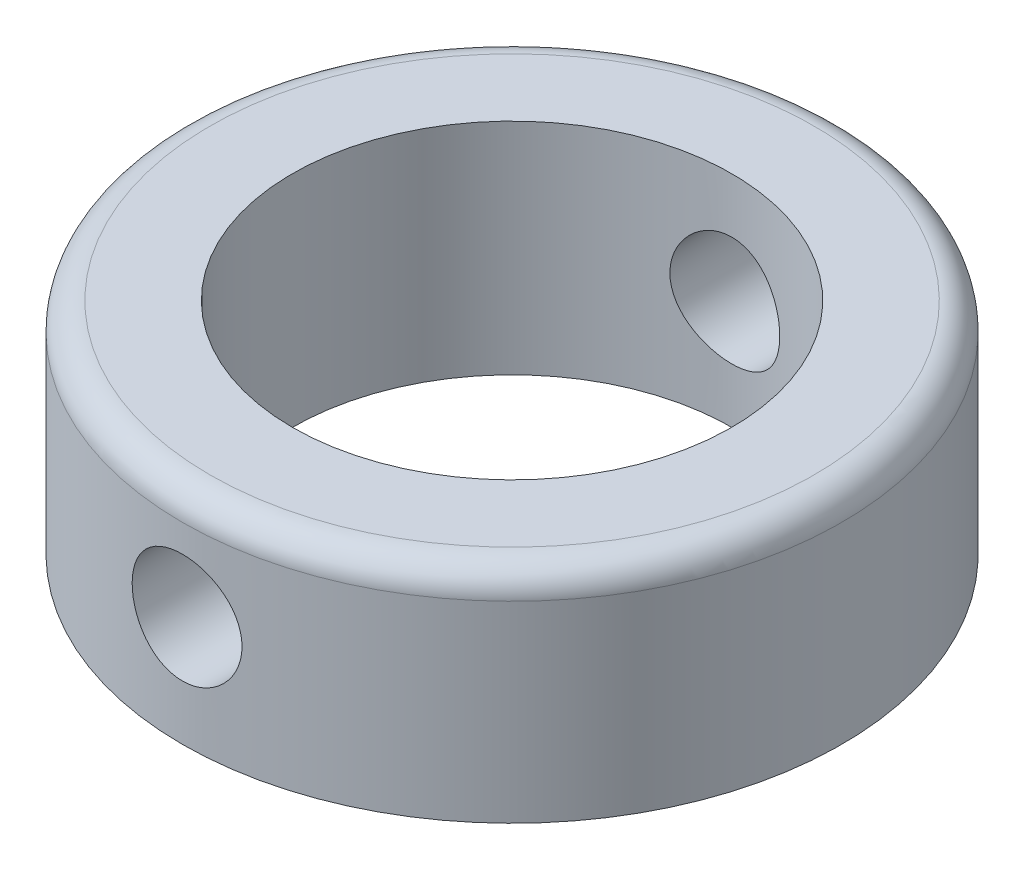
ISO-10303-21;
HEADER;
FILE_DESCRIPTION(('STEP AP214'),'2;1');
FILE_NAME('part.step','',(''),(''),'','','');
FILE_SCHEMA(('AUTOMOTIVE_DESIGN { 1 0 10303 214 1 1 1 1 }'));
ENDSEC;
DATA;
#1=APPLICATION_CONTEXT('core data for automotive mechanical design processes');
#2=APPLICATION_PROTOCOL_DEFINITION('international standard','automotive_design',2000,#1);
#3=PRODUCT_CONTEXT('',#1,'mechanical');
#4=PRODUCT('Part','Part','',(#3));
#5=PRODUCT_RELATED_PRODUCT_CATEGORY('part','',(#4));
#6=PRODUCT_DEFINITION_FORMATION('','',#4);
#7=PRODUCT_DEFINITION_CONTEXT('part definition',#1,'design');
#8=PRODUCT_DEFINITION('design','',#6,#7);
#9=PRODUCT_DEFINITION_SHAPE('','',#8);
#10=(LENGTH_UNIT() NAMED_UNIT(*) SI_UNIT(.MILLI.,.METRE.));
#11=(NAMED_UNIT(*) PLANE_ANGLE_UNIT() SI_UNIT($,.RADIAN.));
#12=(NAMED_UNIT(*) SI_UNIT($,.STERADIAN.) SOLID_ANGLE_UNIT());
#13=UNCERTAINTY_MEASURE_WITH_UNIT(LENGTH_MEASURE(1.E-05),#10,'distance_accuracy_value','');
#14=(GEOMETRIC_REPRESENTATION_CONTEXT(3) GLOBAL_UNCERTAINTY_ASSIGNED_CONTEXT((#13)) GLOBAL_UNIT_ASSIGNED_CONTEXT((#10,
#11,#12)) REPRESENTATION_CONTEXT('',''));
#15=CARTESIAN_POINT('',(0.,0.,0.));
#16=DIRECTION('',(0.,0.,1.));
#17=DIRECTION('',(1.,0.,0.));
#18=AXIS2_PLACEMENT_3D('',#15,#16,#17);
#19=CARTESIAN_POINT('',(0.,8.,0.));
#20=DIRECTION('',(0.,1.,0.));
#21=DIRECTION('',(0.,0.,1.));
#22=AXIS2_PLACEMENT_3D('',#19,#20,#21);
#23=PLANE('',#22);
#24=CARTESIAN_POINT('',(0.,8.,0.));
#25=DIRECTION('',(0.,1.,0.));
#26=DIRECTION('',(0.,0.,1.));
#27=AXIS2_PLACEMENT_3D('',#24,#25,#26);
#28=CIRCLE('',#27,11.);
#29=CARTESIAN_POINT('',(0.,8.,11.));
#30=VERTEX_POINT('',#29);
#31=EDGE_CURVE('E44',#30,#30,#28,.T.);
#32=ORIENTED_EDGE('',*,*,#31,.T.);
#33=EDGE_LOOP('',(#32));
#34=FACE_BOUND('',#33,.T.);
#35=CARTESIAN_POINT('',(0.,8.,0.));
#36=DIRECTION('',(0.,1.,0.));
#37=DIRECTION('',(0.,0.,1.));
#38=AXIS2_PLACEMENT_3D('',#35,#36,#37);
#39=CIRCLE('',#38,8.);
#40=CARTESIAN_POINT('',(0.,8.,8.));
#41=VERTEX_POINT('',#40);
#42=EDGE_CURVE('E97',#41,#41,#39,.T.);
#43=ORIENTED_EDGE('',*,*,#42,.F.);
#44=EDGE_LOOP('',(#43));
#45=FACE_BOUND('',#44,.T.);
#46=ADVANCED_FACE('F31',(#34,#45),#23,.T.);
#47=CARTESIAN_POINT('',(0.,0.,0.));
#48=DIRECTION('',(0.,1.,0.));
#49=DIRECTION('',(0.,0.,1.));
#50=AXIS2_PLACEMENT_3D('',#47,#48,#49);
#51=PLANE('',#50);
#52=CARTESIAN_POINT('',(0.,0.,0.));
#53=DIRECTION('',(0.,1.,0.));
#54=DIRECTION('',(0.,0.,1.));
#55=AXIS2_PLACEMENT_3D('',#52,#53,#54);
#56=CIRCLE('',#55,12.);
#57=CARTESIAN_POINT('',(0.,0.,12.));
#58=VERTEX_POINT('',#57);
#59=EDGE_CURVE('E49',#58,#58,#56,.T.);
#60=ORIENTED_EDGE('',*,*,#59,.F.);
#61=EDGE_LOOP('',(#60));
#62=FACE_BOUND('',#61,.T.);
#63=CARTESIAN_POINT('',(0.,0.,0.));
#64=DIRECTION('',(0.,1.,0.));
#65=DIRECTION('',(0.,0.,1.));
#66=AXIS2_PLACEMENT_3D('',#63,#64,#65);
#67=CIRCLE('',#66,8.);
#68=CARTESIAN_POINT('',(0.,0.,8.));
#69=VERTEX_POINT('',#68);
#70=EDGE_CURVE('E99',#69,#69,#67,.T.);
#71=ORIENTED_EDGE('',*,*,#70,.T.);
#72=EDGE_LOOP('',(#71));
#73=FACE_BOUND('',#72,.T.);
#74=ADVANCED_FACE('F84',(#62,#73),#51,.F.);
#75=CARTESIAN_POINT('',(0.,8.,0.));
#76=DIRECTION('',(0.,-1.,0.));
#77=DIRECTION('',(0.,0.,-1.));
#78=AXIS2_PLACEMENT_3D('',#75,#76,#77);
#79=CYLINDRICAL_SURFACE('',#78,12.);
#80=CARTESIAN_POINT('',(0.,6.,-12.));
#81=CARTESIAN_POINT('',(-0.111512723966572,5.99999552884175,-11.9999980893506));
#82=CARTESIAN_POINT('',(-0.223086305471056,5.99064218002486,-11.9984294233043));
#83=CARTESIAN_POINT('',(-0.443104177338434,5.95349147298774,-11.9923227595311));
#84=CARTESIAN_POINT('',(-0.551545494367397,5.92567715447072,-11.9877820313911));
#85=CARTESIAN_POINT('',(-0.762083797770114,5.8524676411258,-11.9762405458916));
#86=CARTESIAN_POINT('',(-0.86418589474552,5.80708682748754,-11.9692418012735));
#87=CARTESIAN_POINT('',(-1.05931347358235,5.70007016635808,-11.9535538166566));
#88=CARTESIAN_POINT('',(-1.15233999190287,5.6384361780136,-11.9448647700355));
#89=CARTESIAN_POINT('',(-1.32757809143334,5.50003593294363,-11.9266665396665));
#90=CARTESIAN_POINT('',(-1.40969032282797,5.4231447082911,-11.9171509745189));
#91=CARTESIAN_POINT('',(-1.55991079892794,5.25668162522175,-11.8984210150139));
#92=CARTESIAN_POINT('',(-1.62801815951278,5.16710896683471,-11.8892066397013));
#93=CARTESIAN_POINT('',(-1.74869370048411,4.97714322704236,-11.8720605260782));
#94=CARTESIAN_POINT('',(-1.8011636422888,4.8766869305562,-11.8641370327331));
#95=CARTESIAN_POINT('',(-1.88844669232898,4.6682323485595,-11.8505583183574));
#96=CARTESIAN_POINT('',(-1.92326099325249,4.56023457305789,-11.8449029441145));
#97=CARTESIAN_POINT('',(-1.97393150222785,4.34081578011477,-11.836564294742));
#98=CARTESIAN_POINT('',(-1.98995922330832,4.22943541079889,-11.8338541478856));
#99=CARTESIAN_POINT('',(-2.0031333802319,4.00553577849322,-11.8316315114932));
#100=CARTESIAN_POINT('',(-2.0002811523112,3.89301659666616,-11.8321187956577));
#101=CARTESIAN_POINT('',(-1.97591607871692,3.67125771097964,-11.8362114309084));
#102=CARTESIAN_POINT('',(-1.95459590551182,3.56199615716381,-11.8397845865513));
#103=CARTESIAN_POINT('',(-1.89420251232276,3.34862294573669,-11.8495959616881));
#104=CARTESIAN_POINT('',(-1.85512868345579,3.24451146488916,-11.8558342725862));
#105=CARTESIAN_POINT('',(-1.76014179687513,3.04381694124727,-11.8703078346728));
#106=CARTESIAN_POINT('',(-1.70414873110377,2.94727247513502,-11.8785525368586));
#107=CARTESIAN_POINT('',(-1.57696961404595,2.76487647956929,-11.8961033473201));
#108=CARTESIAN_POINT('',(-1.50578233652343,2.67902581403605,-11.9054095412343));
#109=CARTESIAN_POINT('',(-1.34918576972724,2.51933913135412,-11.9241762230383));
#110=CARTESIAN_POINT('',(-1.2636111710985,2.44566518516793,-11.9336371938532));
#111=CARTESIAN_POINT('',(-1.08122819918532,2.31369778986773,-11.9515408111738));
#112=CARTESIAN_POINT('',(-0.984419753525137,2.25540443985342,-11.959983451118));
#113=CARTESIAN_POINT('',(-0.782164732933369,2.15583821829097,-11.9749111431433));
#114=CARTESIAN_POINT('',(-0.676710980451729,2.11457966453499,-11.9813945472596));
#115=CARTESIAN_POINT('',(-0.460238676482185,2.05040462780322,-11.9916600241013));
#116=CARTESIAN_POINT('',(-0.349220591343574,2.02748661042103,-11.9954423228038));
#117=CARTESIAN_POINT('',(-0.126167921041299,2.00086291323109,-11.9998490387415));
#118=CARTESIAN_POINT('',(-0.0141605897208093,1.99693474255552,-12.0005100241023));
#119=CARTESIAN_POINT('',(0.20891181831191,2.0078090755425,-11.9986997953694));
#120=CARTESIAN_POINT('',(0.319976931113631,2.02261085850699,-11.9962287017929));
#121=CARTESIAN_POINT('',(0.537324940437411,2.07033987946838,-11.9884546155056));
#122=CARTESIAN_POINT('',(0.643632694708303,2.1031569667121,-11.9831688384105));
#123=CARTESIAN_POINT('',(0.849237507888353,2.18586761455963,-11.9703557156429));
#124=CARTESIAN_POINT('',(0.948534172727775,2.23576213410822,-11.9628282440962));
#125=CARTESIAN_POINT('',(1.13826455157517,2.35172089975743,-11.9462761304193));
#126=CARTESIAN_POINT('',(1.22861220074972,2.4179241249338,-11.9372388470962));
#127=CARTESIAN_POINT('',(1.39699486840215,2.56442985230805,-11.9187077391352));
#128=CARTESIAN_POINT('',(1.47502899175727,2.64473337862134,-11.9092138813724));
#129=CARTESIAN_POINT('',(1.6173942237264,2.81815803845714,-11.8907214018868));
#130=CARTESIAN_POINT('',(1.68157500889097,2.91140333241153,-11.8817289290968));
#131=CARTESIAN_POINT('',(1.79336184823599,3.10748237531083,-11.8653722382231));
#132=CARTESIAN_POINT('',(1.84096842781586,3.210315820182,-11.8580079685282));
#133=CARTESIAN_POINT('',(1.91803066517852,3.42223178624971,-11.8457876295816));
#134=CARTESIAN_POINT('',(1.94756114603836,3.53128647602439,-11.8409212344885));
#135=CARTESIAN_POINT('',(1.98786836302262,3.75289610337741,-11.8342217346821));
#136=CARTESIAN_POINT('',(1.99864672955693,3.86545073578564,-11.8323883662618));
#137=CARTESIAN_POINT('',(2.00109829283788,4.08936413276993,-11.8319738646721));
#138=CARTESIAN_POINT('',(1.99300810890015,4.20072030286023,-11.8333524520452));
#139=CARTESIAN_POINT('',(1.95846387116548,4.42046339844061,-11.8391182516298));
#140=CARTESIAN_POINT('',(1.93200987688998,4.5288503335535,-11.8435054540897));
#141=CARTESIAN_POINT('',(1.86157959167592,4.73948674983409,-11.8547788502537));
#142=CARTESIAN_POINT('',(1.81762367248035,4.84174320804482,-11.8616621377574));
#143=CARTESIAN_POINT('',(1.71346160313273,5.03746853535588,-11.8771549513777));
#144=CARTESIAN_POINT('',(1.65325464699885,5.13093696829771,-11.8857645631072));
#145=CARTESIAN_POINT('',(1.51745510749772,5.3076284664862,-11.903867632365));
#146=CARTESIAN_POINT('',(1.44168845087492,5.39071681336022,-11.9133703646104));
#147=CARTESIAN_POINT('',(1.27728722510418,5.54308128357995,-11.9321149788867));
#148=CARTESIAN_POINT('',(1.18864969033011,5.61235421491054,-11.9413568002124));
#149=CARTESIAN_POINT('',(1.00029533571223,5.73555861455996,-11.9586122371378));
#150=CARTESIAN_POINT('',(0.900506230026255,5.78938083145036,-11.9666169300248));
#151=CARTESIAN_POINT('',(0.693210455503185,5.87941558768794,-11.9804093408142));
#152=CARTESIAN_POINT('',(0.585711595864008,5.91564566486376,-11.9861992654199));
#153=CARTESIAN_POINT('',(0.398162648036321,5.96160421930133,-11.9936463266636));
#154=CARTESIAN_POINT('',(0.319247064238758,5.97597957569277,-11.9960162181869));
#155=CARTESIAN_POINT('',(0.160231448255847,5.9951789902758,-11.999193727889));
#156=CARTESIAN_POINT('',(0.0801314364867954,6.00000321290989,-12.0000013729651));
#157=CARTESIAN_POINT('',(0.,6.,-12.));
#158=B_SPLINE_CURVE_WITH_KNOTS('',3,(#80,#81,#82,#83,#84,#85,#86,#87,#88,#89,#90,#91,#92,#93,
#94,#95,#96,#97,#98,#99,#100,#101,#102,#103,#104,#105,#106,#107,#108,#109,#110,#111,#112,#113,
#114,#115,#116,#117,#118,#119,#120,#121,#122,#123,#124,#125,#126,#127,#128,#129,#130,#131,#132,
#133,#134,#135,#136,#137,#138,#139,#140,#141,#142,#143,#144,#145,#146,#147,#148,#149,#150,#151,
#152,#153,#154,#155,#156,#157),.UNSPECIFIED.,.T.,.F.,(4,2,2,2,2,2,2,2,2,2,2,2,2,2,2,2,2,2,2,2,2,
2,2,2,2,2,2,2,2,2,2,2,2,2,2,2,2,2,4),(0.,0.334245267950807,0.668798036556336,1.00307749362022,
1.33731873013983,1.67441992849866,2.01154240135885,2.35074016659072,2.68991501500945,
3.02596861682739,3.36199843456709,3.69456417408327,4.02714132020305,4.36131645306046,
4.69551856544459,5.03386215929061,5.37220793308678,5.71083751132722,6.04943875616919,
6.38406306793117,6.71867450428688,7.05126245605132,7.38386908660853,7.71941460501619,
8.05498450443426,8.39403057606095,8.73306589900754,9.07068817873417,9.40828110229294,
9.7416632761816,10.0750443695051,10.4080385458098,10.7410492402347,11.0780110735471,
11.4150506710318,11.7544178528576,12.0934460170406,12.3336339853121,12.5738178182157),.UNSPECIFIED.);
#159=CARTESIAN_POINT('',(0.,6.,-12.));
#160=VERTEX_POINT('',#159);
#161=EDGE_CURVE('E75',#160,#160,#158,.T.);
#162=ORIENTED_EDGE('',*,*,#161,.T.);
#163=EDGE_LOOP('',(#162));
#164=FACE_BOUND('',#163,.T.);
#165=CARTESIAN_POINT('',(2.,4.,11.8321595661992));
#166=CARTESIAN_POINT('',(1.99999551873586,3.88849940147055,11.8321615789328));
#167=CARTESIAN_POINT('',(1.99064413522262,3.77693791514282,11.8337527390819));
#168=CARTESIAN_POINT('',(1.9535019424531,3.55694516538947,11.8399396576003));
#169=CARTESIAN_POINT('',(1.92569412824689,3.44851688499355,11.844538186771));
#170=CARTESIAN_POINT('',(1.8525036349364,3.23800617332671,11.8562048749385));
#171=CARTESIAN_POINT('',(1.80713564394559,3.1359185210702,11.8632709694721));
#172=CARTESIAN_POINT('',(1.70014919751157,2.94081523622578,11.8790741768183));
#173=CARTESIAN_POINT('',(1.63853257080106,2.84779858433813,11.8878111015538));
#174=CARTESIAN_POINT('',(1.50015002157323,2.67254972020435,11.906067769247));
#175=CARTESIAN_POINT('',(1.42325523914587,2.59041989489103,11.9155937386236));
#176=CARTESIAN_POINT('',(1.25677760375622,2.44016535451055,11.9342998453486));
#177=CARTESIAN_POINT('',(1.16719399931998,2.37204146950767,11.9434799621739));
#178=CARTESIAN_POINT('',(0.977218295958685,2.25134834622458,11.9605258958617));
#179=CARTESIAN_POINT('',(0.876764865165367,2.19887439381456,11.9683835394587));
#180=CARTESIAN_POINT('',(0.668316497379094,2.11158314357556,11.9818298956567));
#181=CARTESIAN_POINT('',(0.56032205126255,2.0767646976921,11.9874187557813));
#182=CARTESIAN_POINT('',(0.340914981075394,2.02608597201288,11.9956538777952));
#183=CARTESIAN_POINT('',(0.229543109343416,2.01005366719625,11.9983268248873));
#184=CARTESIAN_POINT('',(0.00566022842063756,1.99686739667792,12.0005206347422));
#185=CARTESIAN_POINT('',(-0.106850702823119,1.99971214780221,12.0000417117545));
#186=CARTESIAN_POINT('',(-0.328641748063101,2.02406508122257,11.9960068674511));
#187=CARTESIAN_POINT('',(-0.437942824560113,2.04538813072732,11.9924814695392));
#188=CARTESIAN_POINT('',(-0.651393583689433,2.10580085939719,11.9827838301731));
#189=CARTESIAN_POINT('',(-0.755543109321203,2.1448910796716,11.9766115081057));
#190=CARTESIAN_POINT('',(-0.956284918226118,2.23991251225226,11.9622615880957));
#191=CARTESIAN_POINT('',(-1.05284041841524,2.29592000966595,11.954074938615));
#192=CARTESIAN_POINT('',(-1.23525242387731,2.42313025810804,11.936605904572));
#193=CARTESIAN_POINT('',(-1.3211080623327,2.49433423896865,11.9273234313531));
#194=CARTESIAN_POINT('',(-1.48077701875733,2.65094304529545,11.9085621458608));
#195=CARTESIAN_POINT('',(-1.55443160180257,2.73650967592079,11.8990823178483));
#196=CARTESIAN_POINT('',(-1.68636367075845,2.91886967217265,11.8811036782784));
#197=CARTESIAN_POINT('',(-1.74464101482593,3.01566314134626,11.8726048757706));
#198=CARTESIAN_POINT('',(-1.84419554759063,3.21791331350198,11.8575500364945));
#199=CARTESIAN_POINT('',(-1.88545362182339,3.32337959847367,11.8509961864208));
#200=CARTESIAN_POINT('',(-1.94962389665249,3.53987925784604,11.840609509519));
#201=CARTESIAN_POINT('',(-1.97253771261436,3.65091214114594,11.8367764431066));
#202=CARTESIAN_POINT('',(-1.99914550790341,3.87397292492971,11.8323116753769));
#203=CARTESIAN_POINT('',(-2.00306576632995,3.98597310376168,11.8316422860694));
#204=CARTESIAN_POINT('',(-1.99217816214597,4.20902933735266,11.8334802782589));
#205=CARTESIAN_POINT('',(-1.97737102289973,4.32008542841118,11.8359875370548));
#206=CARTESIAN_POINT('',(-1.92964186794248,4.53738220735269,11.8438614996401));
#207=CARTESIAN_POINT('',(-1.89683503251711,4.64364891190241,11.8492100153468));
#208=CARTESIAN_POINT('',(-1.81415855215382,4.84917613302359,11.862148584044));
#209=CARTESIAN_POINT('',(-1.76428788648075,4.94843623004072,11.8697387711246));
#210=CARTESIAN_POINT('',(-1.64836533858338,5.13813967552489,11.8863930271791));
#211=CARTESIAN_POINT('',(-1.58216845132749,5.22849325820485,11.8954700448028));
#212=CARTESIAN_POINT('',(-1.43567157256638,5.396890826156,11.9140373334389));
#213=CARTESIAN_POINT('',(-1.35537058910724,5.47493394488779,11.9235276334826));
#214=CARTESIAN_POINT('',(-1.18194245626305,5.61732151418296,11.9419713769461));
#215=CARTESIAN_POINT('',(-1.08869060270896,5.68151506102763,11.9509182107574));
#216=CARTESIAN_POINT('',(-0.892594758359461,5.7933242616039,11.9671608994635));
#217=CARTESIAN_POINT('',(-0.789751077976501,5.84094045157908,11.9744568077598));
#218=CARTESIAN_POINT('',(-0.577839241201062,5.91800846716389,11.9865468653567));
#219=CARTESIAN_POINT('',(-0.468800450082088,5.94753926058794,11.9913518765409));
#220=CARTESIAN_POINT('',(-0.247224587899368,5.98785247917106,11.9979646653543));
#221=CARTESIAN_POINT('',(-0.134687805457295,5.99863644698588,11.9997726896015));
#222=CARTESIAN_POINT('',(0.0892330206189423,6.00110550584976,12.0001843031025));
#223=CARTESIAN_POINT('',(0.200614528482133,5.99302020315287,11.9988264161935));
#224=CARTESIAN_POINT('',(0.420409579451765,5.95847686218446,11.9931374270987));
#225=CARTESIAN_POINT('',(0.528823139173984,5.93201892679226,11.9888063415615));
#226=CARTESIAN_POINT('',(0.739517156734831,5.86156946756508,11.9776559106192));
#227=CARTESIAN_POINT('',(0.841804297723056,5.81759746543196,11.970839336327));
#228=CARTESIAN_POINT('',(1.03758436238573,5.71339365101553,11.9554620550242));
#229=CARTESIAN_POINT('',(1.13107686889458,5.65316106795004,11.9469012653393));
#230=CARTESIAN_POINT('',(1.30777035642112,5.5173319260316,11.9288610369313));
#231=CARTESIAN_POINT('',(1.3908411444822,5.44156723619899,11.919372196329));
#232=CARTESIAN_POINT('',(1.54317110076073,5.27717735367695,11.9006104265149));
#233=CARTESIAN_POINT('',(1.61242702936952,5.18854915286997,11.8913375483961));
#234=CARTESIAN_POINT('',(1.73561141672869,5.00020374200831,11.8739867482713));
#235=CARTESIAN_POINT('',(1.78942799124616,4.90041252818761,11.8659177427663));
#236=CARTESIAN_POINT('',(1.87945162912342,4.69311261132948,11.8519936807305));
#237=CARTESIAN_POINT('',(1.91567628417846,4.58561174185811,11.846136413799));
#238=CARTESIAN_POINT('',(1.96162084250194,4.39807698441009,11.8385979588519));
#239=CARTESIAN_POINT('',(1.97598993413711,4.31917855362992,11.8361969873557));
#240=CARTESIAN_POINT('',(1.99518103614505,4.16019721213045,11.8329770823046));
#241=CARTESIAN_POINT('',(2.00000321983422,4.08011432294064,11.8321581200295));
#242=CARTESIAN_POINT('',(2.,4.,11.8321595661992));
#243=B_SPLINE_CURVE_WITH_KNOTS('',3,(#165,#166,#167,#168,#169,#170,#171,#172,#173,#174,#175,
#176,#177,#178,#179,#180,#181,#182,#183,#184,#185,#186,#187,#188,#189,#190,#191,#192,#193,#194,
#195,#196,#197,#198,#199,#200,#201,#202,#203,#204,#205,#206,#207,#208,#209,#210,#211,#212,#213,
#214,#215,#216,#217,#218,#219,#220,#221,#222,#223,#224,#225,#226,#227,#228,#229,#230,#231,#232,
#233,#234,#235,#236,#237,#238,#239,#240,#241,#242),.UNSPECIFIED.,.T.,.F.,(4,2,2,2,2,2,2,2,2,2,2,
2,2,2,2,2,2,2,2,2,2,2,2,2,2,2,2,2,2,2,2,2,2,2,2,2,2,2,4),(0.,0.334208831142192,
0.668726015970376,1.00296399830015,1.33716437924219,1.67431327324572,2.01148214267558,
2.35066384089148,2.6898234808889,3.02585253978052,3.36185875722154,3.69453696931735,
4.02722531399626,4.3614368331154,4.69567540981411,5.03396898769699,5.37226568596815,
5.71094129998883,6.04958708750461,6.38418833936328,6.71877666731181,7.05124851708393,
7.3837402583486,7.71929874210162,8.05488083544551,8.39395290428305,8.73301400381358,
9.07058387534117,9.40812596729881,9.74158221012733,10.0750365857506,10.4081203186597,
10.7412198431387,11.078135979706,11.4151310310545,11.7545098209466,12.0935485339556,
12.3336853643501,12.5738178352145),.UNSPECIFIED.);
#244=CARTESIAN_POINT('',(2.,4.,11.8321595661992));
#245=VERTEX_POINT('',#244);
#246=EDGE_CURVE('E70',#245,#245,#243,.T.);
#247=ORIENTED_EDGE('',*,*,#246,.T.);
#248=EDGE_LOOP('',(#247));
#249=FACE_BOUND('',#248,.T.);
#250=CARTESIAN_POINT('',(0.,7.,0.));
#251=DIRECTION('',(0.,1.,0.));
#252=DIRECTION('',(0.,0.,1.));
#253=AXIS2_PLACEMENT_3D('',#250,#251,#252);
#254=CIRCLE('',#253,12.);
#255=CARTESIAN_POINT('',(0.,7.,12.));
#256=VERTEX_POINT('',#255);
#257=EDGE_CURVE('E10',#256,#256,#254,.F.);
#258=ORIENTED_EDGE('',*,*,#257,.T.);
#259=EDGE_LOOP('',(#258));
#260=FACE_BOUND('',#259,.T.);
#261=ORIENTED_EDGE('',*,*,#59,.T.);
#262=EDGE_LOOP('',(#261));
#263=FACE_BOUND('',#262,.T.);
#264=ADVANCED_FACE('F80',(#164,#249,#260,#263),#79,.T.);
#265=CARTESIAN_POINT('',(0.,8.,0.));
#266=DIRECTION('',(0.,-1.,0.));
#267=DIRECTION('',(0.,0.,-1.));
#268=AXIS2_PLACEMENT_3D('',#265,#266,#267);
#269=CYLINDRICAL_SURFACE('',#268,8.);
#270=CARTESIAN_POINT('',(0.,6.,-8.));
#271=CARTESIAN_POINT('',(-0.110501451559641,5.99999689901579,-7.9999981315735));
#272=CARTESIAN_POINT('',(-0.221037543774351,5.99081126563495,-7.99768770842435));
#273=CARTESIAN_POINT('',(-0.438941765027377,5.95436646492399,-7.98869485106526));
#274=CARTESIAN_POINT('',(-0.546308062494319,5.92709705394953,-7.98200993893301));
#275=CARTESIAN_POINT('',(-0.754694496243435,5.85541432871722,-7.96500835109376));
#276=CARTESIAN_POINT('',(-0.855722084573335,5.81102160171297,-7.95469603789411));
#277=CARTESIAN_POINT('',(-1.04889617587257,5.70642481327354,-7.93153791743495));
#278=CARTESIAN_POINT('',(-1.14104237913168,5.64622021850804,-7.91869202472209));
#279=CARTESIAN_POINT('',(-1.31573590306789,5.51039894712776,-7.89156551455591));
#280=CARTESIAN_POINT('',(-1.39807425341474,5.43451790005459,-7.87726276197502));
#281=CARTESIAN_POINT('',(-1.54899856960443,5.27006372678795,-7.84898160157248));
#282=CARTESIAN_POINT('',(-1.61758298259892,5.18148916940409,-7.83500323053157));
#283=CARTESIAN_POINT('',(-1.74003539039863,4.99253969768401,-7.80873034264225));
#284=CARTESIAN_POINT('',(-1.79366962123352,4.89200902558836,-7.79646392619748));
#285=CARTESIAN_POINT('',(-1.88319587806766,4.68300211778662,-7.77532659757355));
#286=CARTESIAN_POINT('',(-1.91909074058685,4.57452715555731,-7.76645514259225));
#287=CARTESIAN_POINT('',(-1.97140644907302,4.35500866906445,-7.7533396892843));
#288=CARTESIAN_POINT('',(-1.98820302444274,4.24406013861601,-7.74900654662681));
#289=CARTESIAN_POINT('',(-2.00301570008854,4.02084190800087,-7.74519149946122));
#290=CARTESIAN_POINT('',(-2.00103485575748,3.90857242574382,-7.74570880570571));
#291=CARTESIAN_POINT('',(-1.97864869951961,3.6887789230062,-7.75145607355756));
#292=CARTESIAN_POINT('',(-1.95869112025418,3.58120583804623,-7.75657150676391));
#293=CARTESIAN_POINT('',(-1.90163224920399,3.37098526545192,-7.77075612894758));
#294=CARTESIAN_POINT('',(-1.86452973609252,3.26833812929477,-7.77982559958985));
#295=CARTESIAN_POINT('',(-1.77385263724958,3.06968264499716,-7.80100151874212));
#296=CARTESIAN_POINT('',(-1.72011555631056,2.97375177094724,-7.81313769959755));
#297=CARTESIAN_POINT('',(-1.59780836801993,2.79210838699091,-7.83906281127988));
#298=CARTESIAN_POINT('',(-1.52923566507845,2.70639766924367,-7.85285203112837));
#299=CARTESIAN_POINT('',(-1.37688456624163,2.5450618457408,-7.88101174053188));
#300=CARTESIAN_POINT('',(-1.29272834422115,2.46979401325153,-7.89538759304001));
#301=CARTESIAN_POINT('',(-1.11281589000493,2.3343716767148,-7.92274620771675));
#302=CARTESIAN_POINT('',(-1.01705930361059,2.27421763431525,-7.93572892732543));
#303=CARTESIAN_POINT('',(-0.816154518241856,2.17059921836749,-7.9589030945892));
#304=CARTESIAN_POINT('',(-0.710975190944832,2.12719287966076,-7.96908480170303));
#305=CARTESIAN_POINT('',(-0.494501344190511,2.05877692572057,-7.98543889321888));
#306=CARTESIAN_POINT('',(-0.383207998867313,2.03376379144248,-7.99161204452374));
#307=CARTESIAN_POINT('',(-0.160719960520036,2.00338991258822,-7.999139990285));
#308=CARTESIAN_POINT('',(-0.0495956266509469,1.9975426318996,-8.00061404677705));
#309=CARTESIAN_POINT('',(0.172043833068677,2.00433200274065,-7.99891739752601));
#310=CARTESIAN_POINT('',(0.282559012859459,2.01696699039884,-7.99574710989128));
#311=CARTESIAN_POINT('',(0.498152358368655,2.05996121118851,-7.98519441503143));
#312=CARTESIAN_POINT('',(0.603286825291672,2.09005501796932,-7.97787512247748));
#313=CARTESIAN_POINT('',(0.807009723270015,2.16680944537126,-7.95984942178845));
#314=CARTESIAN_POINT('',(0.905597492043512,2.21347173908423,-7.94914267159856));
#315=CARTESIAN_POINT('',(1.0953641792398,2.3229815051663,-7.92524410568414));
#316=CARTESIAN_POINT('',(1.18638058911444,2.38610148319568,-7.91201156489243));
#317=CARTESIAN_POINT('',(1.35670215152433,2.52638654506263,-7.88459345583226));
#318=CARTESIAN_POINT('',(1.43600527863068,2.60355405282254,-7.87040772335606));
#319=CARTESIAN_POINT('',(1.58265409076364,2.77200261445929,-7.84225275947695));
#320=CARTESIAN_POINT('',(1.64965849016271,2.86358360400323,-7.82829738916375));
#321=CARTESIAN_POINT('',(1.7673476786836,3.05697684595429,-7.80257171169652));
#322=CARTESIAN_POINT('',(1.81803319221058,3.15878864394634,-7.79080130756035));
#323=CARTESIAN_POINT('',(1.90126856081239,3.3692076298841,-7.77090792979554));
#324=CARTESIAN_POINT('',(1.93392586220542,3.47777017112534,-7.76276340389207));
#325=CARTESIAN_POINT('',(1.98046087993837,3.69907951718548,-7.75102325453578));
#326=CARTESIAN_POINT('',(1.99434270330488,3.81182540137665,-7.74742663626581));
#327=CARTESIAN_POINT('',(2.00271812044533,4.03482803180694,-7.74526534938609));
#328=CARTESIAN_POINT('',(1.99775719704016,4.14506324683297,-7.74655910304352));
#329=CARTESIAN_POINT('',(1.96983637108382,4.36307185155731,-7.7537054534379));
#330=CARTESIAN_POINT('',(1.94687683024903,4.47084529068487,-7.75955795855809));
#331=CARTESIAN_POINT('',(1.88390842592373,4.68027794542054,-7.77508347576963));
#332=CARTESIAN_POINT('',(1.84400187290717,4.78196974032028,-7.78473353648412));
#333=CARTESIAN_POINT('',(1.7483532181401,4.97728717695158,-7.80677007633105));
#334=CARTESIAN_POINT('',(1.69260892004559,5.07091169758255,-7.81915693494364));
#335=CARTESIAN_POINT('',(1.56515699818285,5.25007283866936,-7.84567512351349));
#336=CARTESIAN_POINT('',(1.49307088388301,5.33533476456528,-7.85984353109009));
#337=CARTESIAN_POINT('',(1.33571916158631,5.49272939306054,-7.88810702995047));
#338=CARTESIAN_POINT('',(1.25045042834819,5.56485897348396,-7.90220210302746));
#339=CARTESIAN_POINT('',(1.06729011560345,5.69521507808614,-7.92903540863551));
#340=CARTESIAN_POINT('',(0.969197896421849,5.75316615156211,-7.94174444487824));
#341=CARTESIAN_POINT('',(0.764354746013969,5.85166328392071,-7.96406566633491));
#342=CARTESIAN_POINT('',(0.65761008458232,5.89222181419805,-7.97368006933042));
#343=CARTESIAN_POINT('',(0.459213670991296,5.94876244043954,-7.98730746087389));
#344=CARTESIAN_POINT('',(0.368506894544091,5.96793499073791,-7.9920344673692));
#345=CARTESIAN_POINT('',(0.185208095381711,5.99355459149592,-7.99838140309264));
#346=CARTESIAN_POINT('',(0.0926162149901548,6.00000259907373,-8.00000156601192));
#347=CARTESIAN_POINT('',(0.,6.,-8.));
#348=B_SPLINE_CURVE_WITH_KNOTS('',3,(#270,#271,#272,#273,#274,#275,#276,#277,#278,#279,#280,
#281,#282,#283,#284,#285,#286,#287,#288,#289,#290,#291,#292,#293,#294,#295,#296,#297,#298,#299,
#300,#301,#302,#303,#304,#305,#306,#307,#308,#309,#310,#311,#312,#313,#314,#315,#316,#317,#318,
#319,#320,#321,#322,#323,#324,#325,#326,#327,#328,#329,#330,#331,#332,#333,#334,#335,#336,#337,
#338,#339,#340,#341,#342,#343,#344,#345,#346,#347),.UNSPECIFIED.,.T.,.F.,(4,2,2,2,2,2,2,2,2,2,2,
2,2,2,2,2,2,2,2,2,2,2,2,2,2,2,2,2,2,2,2,2,2,2,2,2,2,2,4),(0.,0.33116494996252,0.662517650351866,
0.99347320304814,1.32443992022577,1.66152580582852,1.99864972773416,2.34078196727742,
2.68285948225824,3.01808393468093,3.3532538415469,3.68029996013785,4.00736937959145,
4.337740371696,4.66816921119311,5.00802001296453,5.34788119415424,5.6889097201658,
6.02987298255951,6.36211078603462,6.69431868154751,7.02160366023144,7.34892169767481,
7.68204783424897,8.01523150681786,8.35659345610395,8.69794025003772,9.03723006156476,
9.37644564340971,9.70591707202577,10.0353818794581,10.3628853408369,10.6904342418696,
11.0265276855097,11.3627009303165,11.7049624733721,12.0469781843289,12.3245632392729,
12.6021274139515),.UNSPECIFIED.);
#349=CARTESIAN_POINT('',(0.,6.,-8.));
#350=VERTEX_POINT('',#349);
#351=EDGE_CURVE('E35',#350,#350,#348,.T.);
#352=ORIENTED_EDGE('',*,*,#351,.F.);
#353=EDGE_LOOP('',(#352));
#354=FACE_BOUND('',#353,.T.);
#355=CARTESIAN_POINT('',(2.,4.,7.74596669241483));
#356=CARTESIAN_POINT('',(1.99999686287446,3.88955939925874,7.74596880070288));
#357=CARTESIAN_POINT('',(1.99082099639812,3.77908408105718,7.74835444811678));
#358=CARTESIAN_POINT('',(1.95441850037103,3.56130593746119,7.75761489594051));
#359=CARTESIAN_POINT('',(1.92718136539368,3.45400499642545,7.76449230897304));
#360=CARTESIAN_POINT('',(1.85559295970563,3.24575716945026,7.7819097967692));
#361=CARTESIAN_POINT('',(1.81126378228359,3.14480227569143,7.79244514152366));
#362=CARTESIAN_POINT('',(1.70681691300911,2.95175131796809,7.81598553623007));
#363=CARTESIAN_POINT('',(1.64669855084855,2.85965563033583,7.82899069102791));
#364=CARTESIAN_POINT('',(1.51096674184951,2.68491068379023,7.856325730845));
#365=CARTESIAN_POINT('',(1.43506951016324,2.60248511971996,7.87067678098427));
#366=CARTESIAN_POINT('',(1.27054565128053,2.45139088451173,7.89890300412235));
#367=CARTESIAN_POINT('',(1.18191783534425,2.3827234995026,7.91277813253111));
#368=CARTESIAN_POINT('',(0.992916160863164,2.26017962589498,7.93872332416466));
#369=CARTESIAN_POINT('',(0.892395660956097,2.20652288947083,7.95076549920474));
#370=CARTESIAN_POINT('',(0.683410547434211,2.11695228467753,7.97144649540787));
#371=CARTESIAN_POINT('',(0.574947108633553,2.08103579846759,7.98008581867475));
#372=CARTESIAN_POINT('',(0.35548700700333,2.02868173233713,7.99283807078544));
#373=CARTESIAN_POINT('',(0.244586175639181,2.01186428453873,7.99703915075451));
#374=CARTESIAN_POINT('',(0.0214630554102164,1.99699329657956,8.00074875285838));
#375=CARTESIAN_POINT('',(-0.0907590356304539,1.99893698223232,8.00025796877363));
#376=CARTESIAN_POINT('',(-0.310704494344774,2.02125988020012,7.99470475962828));
#377=CARTESIAN_POINT('',(-0.418472431202133,2.04122906004309,7.98974401872699));
#378=CARTESIAN_POINT('',(-0.629076494827372,2.0983770160388,7.97592669219883));
#379=CARTESIAN_POINT('',(-0.731912358740875,2.13555670830193,7.96706989918753));
#380=CARTESIAN_POINT('',(-0.930813407003612,2.22640205654965,7.94630007760717));
#381=CARTESIAN_POINT('',(-1.02680901953301,2.2802136357294,7.93436015756043));
#382=CARTESIAN_POINT('',(-1.20855124468098,2.40268454329301,7.90871923047719));
#383=CARTESIAN_POINT('',(-1.29429607017101,2.47134645484849,7.89501791721992));
#384=CARTESIAN_POINT('',(-1.45554807016991,2.6237669935859,7.86690971015616));
#385=CARTESIAN_POINT('',(-1.5307153581504,2.70788391387822,7.85249375620734));
#386=CARTESIAN_POINT('',(-1.66595275192604,2.8876799788322,7.82492034813365));
#387=CARTESIAN_POINT('',(-1.72602215209203,2.9833596635928,7.81176295284776));
#388=CARTESIAN_POINT('',(-1.8295762580452,3.18423202731917,7.78816397465319));
#389=CARTESIAN_POINT('',(-1.87297913394098,3.28946858425056,7.77773586980577));
#390=CARTESIAN_POINT('',(-1.94137124127268,3.50606837446116,7.76094912111966));
#391=CARTESIAN_POINT('',(-1.96636441310582,3.61743029118651,7.75458960648175));
#392=CARTESIAN_POINT('',(-1.99666371093214,3.8399676012185,7.74684284831313));
#393=CARTESIAN_POINT('',(-2.0024723791357,3.9510702346637,7.74532871274919));
#394=CARTESIAN_POINT('',(-1.99561359241244,4.17265754926253,7.74709874784831));
#395=CARTESIAN_POINT('',(-1.98294783827904,4.28314228636099,7.75038247681013));
#396=CARTESIAN_POINT('',(-1.93994037115013,4.49849141196376,7.76125665563648));
#397=CARTESIAN_POINT('',(-1.9098912546254,4.60341818125667,7.768775761875));
#398=CARTESIAN_POINT('',(-1.8332944653365,4.80674516628135,7.7872057461677));
#399=CARTESIAN_POINT('',(-1.78674483817004,4.90514460724427,7.79811702598891));
#400=CARTESIAN_POINT('',(-1.67741653434925,5.09475302229388,7.8223690967461));
#401=CARTESIAN_POINT('',(-1.6143374030685,5.18578307203448,7.83575334885313));
#402=CARTESIAN_POINT('',(-1.47412058586891,5.35615069024108,7.86333666457373));
#403=CARTESIAN_POINT('',(-1.39698058961088,5.43548633332006,7.87753586182776));
#404=CARTESIAN_POINT('',(-1.22852544196945,5.58224883405676,7.90557922425285));
#405=CARTESIAN_POINT('',(-1.13690390506319,5.64932805003905,7.91940561649468));
#406=CARTESIAN_POINT('',(-0.943405365389351,5.76714869356099,7.94477773290987));
#407=CARTESIAN_POINT('',(-0.841528897915183,5.81789097328656,7.95632357603169));
#408=CARTESIAN_POINT('',(-0.631116403462182,5.90115682762235,7.9757609259065));
#409=CARTESIAN_POINT('',(-0.522634762055765,5.93381142750325,7.98367864017925));
#410=CARTESIAN_POINT('',(-0.301499520637615,5.98036826768673,7.99508234716634));
#411=CARTESIAN_POINT('',(-0.188846730082482,5.99427412699123,7.99856919514738));
#412=CARTESIAN_POINT('',(0.0341670528866453,6.00273517915108,8.00068338817612));
#413=CARTESIAN_POINT('',(0.144507653932042,5.99780341819082,7.99943957759977));
#414=CARTESIAN_POINT('',(0.3627349928295,5.9699043454113,7.99251792914887));
#415=CARTESIAN_POINT('',(0.470621803561856,5.94693756997366,7.98684022314338));
#416=CARTESIAN_POINT('',(0.680342071289547,5.88389556045828,7.97170865707778));
#417=CARTESIAN_POINT('',(0.782204989161725,5.84391309337124,7.96227529004785));
#418=CARTESIAN_POINT('',(0.977834106083248,5.74805884196086,7.94062577827316));
#419=CARTESIAN_POINT('',(1.07159928253127,5.69218505465903,7.92840928277515));
#420=CARTESIAN_POINT('',(1.25080385684661,5.56456953200773,7.90214499360574));
#421=CARTESIAN_POINT('',(1.33598997659667,5.49247971419234,7.88806033883329));
#422=CARTESIAN_POINT('',(1.49323004054701,5.33515429604531,7.85981298114379));
#423=CARTESIAN_POINT('',(1.56528065015318,5.24991536777768,7.84565025934604));
#424=CARTESIAN_POINT('',(1.69552405294366,5.06679717162108,7.81854951691005));
#425=CARTESIAN_POINT('',(1.75343323883276,4.96871175326949,7.80563927346578));
#426=CARTESIAN_POINT('',(1.85185379317094,4.76388902025036,7.78287910989656));
#427=CARTESIAN_POINT('',(1.8923778195043,4.65715806781231,7.77302696466427));
#428=CARTESIAN_POINT('',(1.94884505714201,4.45884597632968,7.75903817501475));
#429=CARTESIAN_POINT('',(1.96798634119376,4.36821367122773,7.75417326006998));
#430=CARTESIAN_POINT('',(1.99356458514354,4.18506226200462,7.7476367716524));
#431=CARTESIAN_POINT('',(2.0000026287435,4.0925433195112,7.74596492578215));
#432=CARTESIAN_POINT('',(2.,4.,7.74596669241483));
#433=B_SPLINE_CURVE_WITH_KNOTS('',3,(#355,#356,#357,#358,#359,#360,#361,#362,#363,#364,#365,
#366,#367,#368,#369,#370,#371,#372,#373,#374,#375,#376,#377,#378,#379,#380,#381,#382,#383,#384,
#385,#386,#387,#388,#389,#390,#391,#392,#393,#394,#395,#396,#397,#398,#399,#400,#401,#402,#403,
#404,#405,#406,#407,#408,#409,#410,#411,#412,#413,#414,#415,#416,#417,#418,#419,#420,#421,#422,
#423,#424,#425,#426,#427,#428,#429,#430,#431,#432),.UNSPECIFIED.,.T.,.F.,(4,2,2,2,2,2,2,2,2,2,2,
2,2,2,2,2,2,2,2,2,2,2,2,2,2,2,2,2,2,2,2,2,2,2,2,2,2,2,4),(0.,0.330981953388909,
0.662156593142932,0.992904581732816,1.32366661404383,1.66099163354381,1.99834817183893,
2.34041197118336,2.68242527877674,3.01751000796277,3.35254518932816,3.68014610151158,
4.00776445379829,4.33834299403556,4.6689790837513,5.00856373257529,5.34816424959842,
5.68941145606722,6.03058560103638,6.36274859809374,6.69488101747041,7.02157924007365,
7.34831617137134,7.68146276687326,8.01466415108036,8.35620264772255,8.69772332575642,
9.03673658245543,9.3756843912723,9.70546756901965,10.0352409390158,10.3632390124777,
10.6912784459046,11.0271767726566,11.3631602525241,11.7054118182895,12.0474137709606,
12.3247826174462,12.6021278008238),.UNSPECIFIED.);
#434=CARTESIAN_POINT('',(2.,4.,7.74596669241483));
#435=VERTEX_POINT('',#434);
#436=EDGE_CURVE('E52',#435,#435,#433,.T.);
#437=ORIENTED_EDGE('',*,*,#436,.F.);
#438=EDGE_LOOP('',(#437));
#439=FACE_BOUND('',#438,.T.);
#440=ORIENTED_EDGE('',*,*,#42,.T.);
#441=EDGE_LOOP('',(#440));
#442=FACE_BOUND('',#441,.T.);
#443=ORIENTED_EDGE('',*,*,#70,.F.);
#444=EDGE_LOOP('',(#443));
#445=FACE_BOUND('',#444,.T.);
#446=ADVANCED_FACE('F57',(#354,#439,#442,#445),#269,.F.);
#447=CARTESIAN_POINT('',(0.,7.,0.));
#448=DIRECTION('',(0.,1.,0.));
#449=DIRECTION('',(0.,0.,1.));
#450=AXIS2_PLACEMENT_3D('',#447,#448,#449);
#451=TOROIDAL_SURFACE('',#450,11.,1.);
#452=ORIENTED_EDGE('',*,*,#257,.F.);
#453=EDGE_LOOP('',(#452));
#454=FACE_BOUND('',#453,.T.);
#455=ORIENTED_EDGE('',*,*,#31,.F.);
#456=EDGE_LOOP('',(#455));
#457=FACE_BOUND('',#456,.T.);
#458=ADVANCED_FACE('F33',(#454,#457),#451,.T.);
#459=CARTESIAN_POINT('',(0.,4.,-12.));
#460=DIRECTION('',(0.,0.,1.));
#461=DIRECTION('',(1.,0.,0.));
#462=AXIS2_PLACEMENT_3D('',#459,#460,#461);
#463=CYLINDRICAL_SURFACE('',#462,2.);
#464=ORIENTED_EDGE('',*,*,#436,.T.);
#465=EDGE_LOOP('',(#464));
#466=FACE_BOUND('',#465,.T.);
#467=ORIENTED_EDGE('',*,*,#246,.F.);
#468=EDGE_LOOP('',(#467));
#469=FACE_BOUND('',#468,.T.);
#470=ADVANCED_FACE('F63',(#466,#469),#463,.F.);
#471=ORIENTED_EDGE('',*,*,#351,.T.);
#472=EDGE_LOOP('',(#471));
#473=FACE_BOUND('',#472,.T.);
#474=ORIENTED_EDGE('',*,*,#161,.F.);
#475=EDGE_LOOP('',(#474));
#476=FACE_BOUND('',#475,.T.);
#477=ADVANCED_FACE('F60',(#473,#476),#463,.F.);
#478=CLOSED_SHELL('',(#46,#74,#264,#446,#458,#470,#477));
#479=MANIFOLD_SOLID_BREP('B2',#478);
#480=ADVANCED_BREP_SHAPE_REPRESENTATION('',(#18,#479),#14);
#481=SHAPE_DEFINITION_REPRESENTATION(#9,#480);
ENDSEC;
END-ISO-10303-21;
